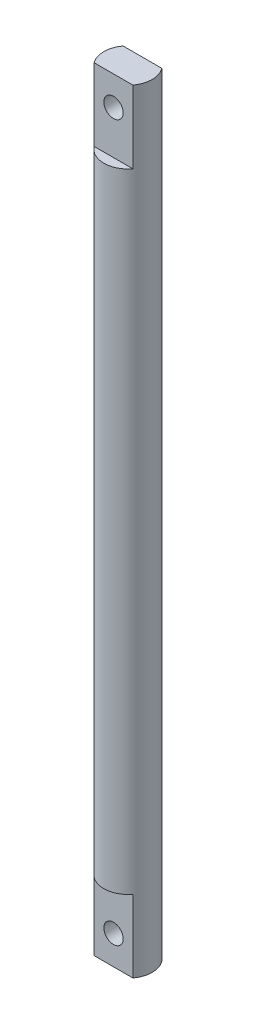
ISO-10303-21;
HEADER;
FILE_DESCRIPTION(('STEP AP214'),'2;1');
FILE_NAME('part.step','',(''),(''),'','','');
FILE_SCHEMA(('AUTOMOTIVE_DESIGN { 1 0 10303 214 1 1 1 1 }'));
ENDSEC;
DATA;
#1=APPLICATION_CONTEXT('core data for automotive mechanical design processes');
#2=APPLICATION_PROTOCOL_DEFINITION('international standard','automotive_design',2000,#1);
#3=PRODUCT_CONTEXT('',#1,'mechanical');
#4=PRODUCT('Part','Part','',(#3));
#5=PRODUCT_RELATED_PRODUCT_CATEGORY('part','',(#4));
#6=PRODUCT_DEFINITION_FORMATION('','',#4);
#7=PRODUCT_DEFINITION_CONTEXT('part definition',#1,'design');
#8=PRODUCT_DEFINITION('design','',#6,#7);
#9=PRODUCT_DEFINITION_SHAPE('','',#8);
#10=(LENGTH_UNIT() NAMED_UNIT(*) SI_UNIT(.MILLI.,.METRE.));
#11=(NAMED_UNIT(*) PLANE_ANGLE_UNIT() SI_UNIT($,.RADIAN.));
#12=(NAMED_UNIT(*) SI_UNIT($,.STERADIAN.) SOLID_ANGLE_UNIT());
#13=UNCERTAINTY_MEASURE_WITH_UNIT(LENGTH_MEASURE(1.E-05),#10,'distance_accuracy_value','');
#14=(GEOMETRIC_REPRESENTATION_CONTEXT(3) GLOBAL_UNCERTAINTY_ASSIGNED_CONTEXT((#13)) GLOBAL_UNIT_ASSIGNED_CONTEXT((#10,
#11,#12)) REPRESENTATION_CONTEXT('',''));
#15=CARTESIAN_POINT('',(0.,0.,0.));
#16=DIRECTION('',(0.,0.,1.));
#17=DIRECTION('',(1.,0.,0.));
#18=AXIS2_PLACEMENT_3D('',#15,#16,#17);
#19=CARTESIAN_POINT('',(0.,80.,0.));
#20=DIRECTION('',(0.,-1.,0.));
#21=DIRECTION('',(0.,0.,-1.));
#22=AXIS2_PLACEMENT_3D('',#19,#20,#21);
#23=CYLINDRICAL_SURFACE('',#22,5.);
#24=CARTESIAN_POINT('',(0.,80.,0.));
#25=DIRECTION('',(0.,1.,0.));
#26=DIRECTION('',(0.,0.,1.));
#27=AXIS2_PLACEMENT_3D('',#24,#25,#26);
#28=CIRCLE('',#27,5.);
#29=CARTESIAN_POINT('',(4.00000000000001,80.,3.));
#30=VERTEX_POINT('',#29);
#31=CARTESIAN_POINT('',(4.00000000000001,80.,-3.));
#32=VERTEX_POINT('',#31);
#33=EDGE_CURVE('E11',#30,#32,#28,.T.);
#34=ORIENTED_EDGE('',*,*,#33,.F.);
#35=DIRECTION('',(0.,1.,0.));
#36=VECTOR('',#35,1.);
#37=CARTESIAN_POINT('',(4.00000000000001,65.,3.));
#38=LINE('',#37,#36);
#39=CARTESIAN_POINT('',(4.00000000000001,65.,3.));
#40=VERTEX_POINT('',#39);
#41=EDGE_CURVE('E153',#40,#30,#38,.T.);
#42=ORIENTED_EDGE('',*,*,#41,.F.);
#43=CARTESIAN_POINT('',(0.,65.,0.));
#44=DIRECTION('',(0.,1.,0.));
#45=DIRECTION('',(0.,0.,1.));
#46=AXIS2_PLACEMENT_3D('',#43,#44,#45);
#47=CIRCLE('',#46,5.);
#48=CARTESIAN_POINT('',(-4.00000000000001,65.,3.));
#49=VERTEX_POINT('',#48);
#50=EDGE_CURVE('E145',#49,#40,#47,.T.);
#51=ORIENTED_EDGE('',*,*,#50,.F.);
#52=DIRECTION('',(0.,1.,0.));
#53=VECTOR('',#52,1.);
#54=CARTESIAN_POINT('',(-4.00000000000001,65.,3.));
#55=LINE('',#54,#53);
#56=CARTESIAN_POINT('',(-4.00000000000001,80.,3.));
#57=VERTEX_POINT('',#56);
#58=EDGE_CURVE('E157',#49,#57,#55,.T.);
#59=ORIENTED_EDGE('',*,*,#58,.T.);
#60=CARTESIAN_POINT('',(-4.00000000000001,80.,-3.));
#61=VERTEX_POINT('',#60);
#62=EDGE_CURVE('E48',#61,#57,#28,.T.);
#63=ORIENTED_EDGE('',*,*,#62,.F.);
#64=DIRECTION('',(0.,1.,0.));
#65=VECTOR('',#64,1.);
#66=CARTESIAN_POINT('',(-4.00000000000001,65.,-3.));
#67=LINE('',#66,#65);
#68=CARTESIAN_POINT('',(-4.00000000000001,65.,-3.));
#69=VERTEX_POINT('',#68);
#70=EDGE_CURVE('E170',#69,#61,#67,.T.);
#71=ORIENTED_EDGE('',*,*,#70,.F.);
#72=CARTESIAN_POINT('',(0.,65.,0.));
#73=DIRECTION('',(0.,1.,0.));
#74=DIRECTION('',(0.,0.,1.));
#75=AXIS2_PLACEMENT_3D('',#72,#73,#74);
#76=CIRCLE('',#75,5.);
#77=CARTESIAN_POINT('',(4.00000000000001,65.,-3.));
#78=VERTEX_POINT('',#77);
#79=EDGE_CURVE('E163',#78,#69,#76,.T.);
#80=ORIENTED_EDGE('',*,*,#79,.F.);
#81=DIRECTION('',(0.,1.,0.));
#82=VECTOR('',#81,1.);
#83=CARTESIAN_POINT('',(4.00000000000001,65.,-3.));
#84=LINE('',#83,#82);
#85=EDGE_CURVE('E156',#78,#32,#84,.T.);
#86=ORIENTED_EDGE('',*,*,#85,.T.);
#87=EDGE_LOOP('',(#34,#42,#51,#59,#63,#71,#80,#86));
#88=FACE_BOUND('',#87,.T.);
#89=DIRECTION('',(0.,-1.,0.));
#90=VECTOR('',#89,1.);
#91=CARTESIAN_POINT('',(-4.00000000000001,-65.,3.));
#92=LINE('',#91,#90);
#93=CARTESIAN_POINT('',(-4.00000000000001,-65.,3.));
#94=VERTEX_POINT('',#93);
#95=CARTESIAN_POINT('',(-4.00000000000001,-80.,3.));
#96=VERTEX_POINT('',#95);
#97=EDGE_CURVE('E55',#94,#96,#92,.T.);
#98=ORIENTED_EDGE('',*,*,#97,.F.);
#99=CARTESIAN_POINT('',(0.,-65.,0.));
#100=DIRECTION('',(0.,1.,0.));
#101=DIRECTION('',(0.,0.,1.));
#102=AXIS2_PLACEMENT_3D('',#99,#100,#101);
#103=CIRCLE('',#102,5.);
#104=CARTESIAN_POINT('',(4.00000000000001,-65.,3.));
#105=VERTEX_POINT('',#104);
#106=EDGE_CURVE('E111',#94,#105,#103,.T.);
#107=ORIENTED_EDGE('',*,*,#106,.T.);
#108=DIRECTION('',(0.,-1.,0.));
#109=VECTOR('',#108,1.);
#110=CARTESIAN_POINT('',(4.00000000000001,-65.,3.));
#111=LINE('',#110,#109);
#112=CARTESIAN_POINT('',(4.00000000000001,-80.,3.));
#113=VERTEX_POINT('',#112);
#114=EDGE_CURVE('E107',#105,#113,#111,.T.);
#115=ORIENTED_EDGE('',*,*,#114,.T.);
#116=CARTESIAN_POINT('',(0.,-80.,0.));
#117=DIRECTION('',(0.,1.,0.));
#118=DIRECTION('',(0.,0.,1.));
#119=AXIS2_PLACEMENT_3D('',#116,#117,#118);
#120=CIRCLE('',#119,5.);
#121=CARTESIAN_POINT('',(4.00000000000001,-80.,-3.));
#122=VERTEX_POINT('',#121);
#123=EDGE_CURVE('E42',#113,#122,#120,.T.);
#124=ORIENTED_EDGE('',*,*,#123,.T.);
#125=DIRECTION('',(0.,-1.,0.));
#126=VECTOR('',#125,1.);
#127=CARTESIAN_POINT('',(4.00000000000001,-65.,-3.));
#128=LINE('',#127,#126);
#129=CARTESIAN_POINT('',(4.00000000000001,-65.,-3.));
#130=VERTEX_POINT('',#129);
#131=EDGE_CURVE('E63',#130,#122,#128,.T.);
#132=ORIENTED_EDGE('',*,*,#131,.F.);
#133=CARTESIAN_POINT('',(0.,-65.,0.));
#134=DIRECTION('',(0.,1.,0.));
#135=DIRECTION('',(0.,0.,1.));
#136=AXIS2_PLACEMENT_3D('',#133,#134,#135);
#137=CIRCLE('',#136,5.);
#138=CARTESIAN_POINT('',(-4.00000000000001,-65.,-3.));
#139=VERTEX_POINT('',#138);
#140=EDGE_CURVE('E129',#130,#139,#137,.T.);
#141=ORIENTED_EDGE('',*,*,#140,.T.);
#142=DIRECTION('',(0.,-1.,0.));
#143=VECTOR('',#142,1.);
#144=CARTESIAN_POINT('',(-4.00000000000001,-65.,-3.));
#145=LINE('',#144,#143);
#146=CARTESIAN_POINT('',(-4.00000000000001,-80.,-3.));
#147=VERTEX_POINT('',#146);
#148=EDGE_CURVE('E140',#139,#147,#145,.T.);
#149=ORIENTED_EDGE('',*,*,#148,.T.);
#150=EDGE_CURVE('E121',#147,#96,#120,.T.);
#151=ORIENTED_EDGE('',*,*,#150,.T.);
#152=EDGE_LOOP('',(#98,#107,#115,#124,#132,#141,#149,#151));
#153=FACE_BOUND('',#152,.T.);
#154=ADVANCED_FACE('F39',(#88,#153),#23,.T.);
#155=CARTESIAN_POINT('',(0.,-80.,0.));
#156=DIRECTION('',(0.,1.,0.));
#157=DIRECTION('',(0.,0.,1.));
#158=AXIS2_PLACEMENT_3D('',#155,#156,#157);
#159=PLANE('',#158);
#160=DIRECTION('',(-1.,0.,0.));
#161=VECTOR('',#160,1.);
#162=CARTESIAN_POINT('',(-4.00000000000001,-80.,3.));
#163=LINE('',#162,#161);
#164=EDGE_CURVE('E116',#113,#96,#163,.T.);
#165=ORIENTED_EDGE('',*,*,#164,.T.);
#166=ORIENTED_EDGE('',*,*,#150,.F.);
#167=DIRECTION('',(1.,0.,0.));
#168=VECTOR('',#167,1.);
#169=CARTESIAN_POINT('',(-4.00000000000001,-80.,-3.));
#170=LINE('',#169,#168);
#171=EDGE_CURVE('E134',#147,#122,#170,.T.);
#172=ORIENTED_EDGE('',*,*,#171,.T.);
#173=ORIENTED_EDGE('',*,*,#123,.F.);
#174=EDGE_LOOP('',(#165,#166,#172,#173));
#175=FACE_BOUND('',#174,.T.);
#176=ADVANCED_FACE('F197',(#175),#159,.F.);
#177=CARTESIAN_POINT('',(0.,80.,0.));
#178=DIRECTION('',(0.,1.,0.));
#179=DIRECTION('',(0.,0.,1.));
#180=AXIS2_PLACEMENT_3D('',#177,#178,#179);
#181=PLANE('',#180);
#182=DIRECTION('',(-1.,0.,0.));
#183=VECTOR('',#182,1.);
#184=CARTESIAN_POINT('',(-4.00000000000001,80.,3.));
#185=LINE('',#184,#183);
#186=EDGE_CURVE('E149',#30,#57,#185,.T.);
#187=ORIENTED_EDGE('',*,*,#186,.F.);
#188=ORIENTED_EDGE('',*,*,#33,.T.);
#189=DIRECTION('',(1.,0.,0.));
#190=VECTOR('',#189,1.);
#191=CARTESIAN_POINT('',(-4.00000000000001,80.,-3.));
#192=LINE('',#191,#190);
#193=EDGE_CURVE('E125',#61,#32,#192,.T.);
#194=ORIENTED_EDGE('',*,*,#193,.F.);
#195=ORIENTED_EDGE('',*,*,#62,.T.);
#196=EDGE_LOOP('',(#187,#188,#194,#195));
#197=FACE_BOUND('',#196,.T.);
#198=ADVANCED_FACE('F188',(#197),#181,.T.);
#199=CARTESIAN_POINT('',(-4.00000000000001,65.,-3.));
#200=DIRECTION('',(0.,0.,1.));
#201=DIRECTION('',(1.,0.,0.));
#202=AXIS2_PLACEMENT_3D('',#199,#200,#201);
#203=PLANE('',#202);
#204=CARTESIAN_POINT('',(0.,74.,-3.));
#205=DIRECTION('',(0.,0.,1.));
#206=DIRECTION('',(1.,0.,0.));
#207=AXIS2_PLACEMENT_3D('',#204,#205,#206);
#208=CIRCLE('',#207,2.);
#209=CARTESIAN_POINT('',(2.,74.,-3.));
#210=VERTEX_POINT('',#209);
#211=EDGE_CURVE('E139',#210,#210,#208,.T.);
#212=ORIENTED_EDGE('',*,*,#211,.T.);
#213=EDGE_LOOP('',(#212));
#214=FACE_BOUND('',#213,.T.);
#215=ORIENTED_EDGE('',*,*,#193,.T.);
#216=ORIENTED_EDGE('',*,*,#85,.F.);
#217=DIRECTION('',(1.,0.,0.));
#218=VECTOR('',#217,1.);
#219=CARTESIAN_POINT('',(-4.00000000000001,65.,-3.));
#220=LINE('',#219,#218);
#221=EDGE_CURVE('E166',#69,#78,#220,.T.);
#222=ORIENTED_EDGE('',*,*,#221,.F.);
#223=ORIENTED_EDGE('',*,*,#70,.T.);
#224=EDGE_LOOP('',(#215,#216,#222,#223));
#225=FACE_BOUND('',#224,.T.);
#226=ADVANCED_FACE('F181',(#214,#225),#203,.F.);
#227=CARTESIAN_POINT('',(0.,65.,0.));
#228=DIRECTION('',(0.,1.,0.));
#229=DIRECTION('',(0.,0.,1.));
#230=AXIS2_PLACEMENT_3D('',#227,#228,#229);
#231=PLANE('',#230);
#232=ORIENTED_EDGE('',*,*,#79,.T.);
#233=ORIENTED_EDGE('',*,*,#221,.T.);
#234=EDGE_LOOP('',(#232,#233));
#235=FACE_BOUND('',#234,.T.);
#236=ADVANCED_FACE('F225',(#235),#231,.T.);
#237=CARTESIAN_POINT('',(-4.00000000000001,65.,3.));
#238=DIRECTION('',(0.,0.,-1.));
#239=DIRECTION('',(-1.,0.,0.));
#240=AXIS2_PLACEMENT_3D('',#237,#238,#239);
#241=PLANE('',#240);
#242=CARTESIAN_POINT('',(0.,74.,3.));
#243=DIRECTION('',(0.,0.,1.));
#244=DIRECTION('',(1.,0.,0.));
#245=AXIS2_PLACEMENT_3D('',#242,#243,#244);
#246=CIRCLE('',#245,2.);
#247=CARTESIAN_POINT('',(2.,74.,3.));
#248=VERTEX_POINT('',#247);
#249=EDGE_CURVE('E324',#248,#248,#246,.T.);
#250=ORIENTED_EDGE('',*,*,#249,.F.);
#251=EDGE_LOOP('',(#250));
#252=FACE_BOUND('',#251,.T.);
#253=ORIENTED_EDGE('',*,*,#186,.T.);
#254=ORIENTED_EDGE('',*,*,#58,.F.);
#255=DIRECTION('',(-1.,0.,0.));
#256=VECTOR('',#255,1.);
#257=CARTESIAN_POINT('',(-4.00000000000001,65.,3.));
#258=LINE('',#257,#256);
#259=EDGE_CURVE('E148',#40,#49,#258,.T.);
#260=ORIENTED_EDGE('',*,*,#259,.F.);
#261=ORIENTED_EDGE('',*,*,#41,.T.);
#262=EDGE_LOOP('',(#253,#254,#260,#261));
#263=FACE_BOUND('',#262,.T.);
#264=ADVANCED_FACE('F229',(#252,#263),#241,.F.);
#265=CARTESIAN_POINT('',(0.,65.,0.));
#266=DIRECTION('',(0.,1.,0.));
#267=DIRECTION('',(0.,0.,1.));
#268=AXIS2_PLACEMENT_3D('',#265,#266,#267);
#269=PLANE('',#268);
#270=ORIENTED_EDGE('',*,*,#50,.T.);
#271=ORIENTED_EDGE('',*,*,#259,.T.);
#272=EDGE_LOOP('',(#270,#271));
#273=FACE_BOUND('',#272,.T.);
#274=ADVANCED_FACE('F211',(#273),#269,.T.);
#275=CARTESIAN_POINT('',(-4.00000000000001,-65.,-3.));
#276=DIRECTION('',(0.,0.,-1.));
#277=DIRECTION('',(-1.,0.,0.));
#278=AXIS2_PLACEMENT_3D('',#275,#276,#277);
#279=PLANE('',#278);
#280=CARTESIAN_POINT('',(0.,-74.,-3.));
#281=DIRECTION('',(0.,0.,-1.));
#282=DIRECTION('',(-1.,0.,0.));
#283=AXIS2_PLACEMENT_3D('',#280,#281,#282);
#284=CIRCLE('',#283,2.);
#285=CARTESIAN_POINT('',(-2.,-74.,-3.));
#286=VERTEX_POINT('',#285);
#287=EDGE_CURVE('E330',#286,#286,#284,.F.);
#288=ORIENTED_EDGE('',*,*,#287,.T.);
#289=EDGE_LOOP('',(#288));
#290=FACE_BOUND('',#289,.T.);
#291=ORIENTED_EDGE('',*,*,#171,.F.);
#292=ORIENTED_EDGE('',*,*,#148,.F.);
#293=DIRECTION('',(1.,0.,0.));
#294=VECTOR('',#293,1.);
#295=CARTESIAN_POINT('',(-4.00000000000001,-65.,-3.));
#296=LINE('',#295,#294);
#297=EDGE_CURVE('E133',#139,#130,#296,.T.);
#298=ORIENTED_EDGE('',*,*,#297,.T.);
#299=ORIENTED_EDGE('',*,*,#131,.T.);
#300=EDGE_LOOP('',(#291,#292,#298,#299));
#301=FACE_BOUND('',#300,.T.);
#302=ADVANCED_FACE('F199',(#290,#301),#279,.T.);
#303=CARTESIAN_POINT('',(0.,-65.,0.));
#304=DIRECTION('',(0.,-1.,0.));
#305=DIRECTION('',(0.,0.,1.));
#306=AXIS2_PLACEMENT_3D('',#303,#304,#305);
#307=PLANE('',#306);
#308=ORIENTED_EDGE('',*,*,#140,.F.);
#309=ORIENTED_EDGE('',*,*,#297,.F.);
#310=EDGE_LOOP('',(#308,#309));
#311=FACE_BOUND('',#310,.T.);
#312=ADVANCED_FACE('F202',(#311),#307,.T.);
#313=CARTESIAN_POINT('',(-4.00000000000001,-65.,3.));
#314=DIRECTION('',(0.,0.,1.));
#315=DIRECTION('',(1.,0.,0.));
#316=AXIS2_PLACEMENT_3D('',#313,#314,#315);
#317=PLANE('',#316);
#318=CARTESIAN_POINT('',(0.,-74.,3.));
#319=DIRECTION('',(0.,0.,-1.));
#320=DIRECTION('',(1.,0.,0.));
#321=AXIS2_PLACEMENT_3D('',#318,#319,#320);
#322=CIRCLE('',#321,2.);
#323=CARTESIAN_POINT('',(2.,-74.,3.));
#324=VERTEX_POINT('',#323);
#325=EDGE_CURVE('E337',#324,#324,#322,.T.);
#326=ORIENTED_EDGE('',*,*,#325,.T.);
#327=EDGE_LOOP('',(#326));
#328=FACE_BOUND('',#327,.T.);
#329=ORIENTED_EDGE('',*,*,#164,.F.);
#330=ORIENTED_EDGE('',*,*,#114,.F.);
#331=DIRECTION('',(-1.,0.,0.));
#332=VECTOR('',#331,1.);
#333=CARTESIAN_POINT('',(-4.00000000000001,-65.,3.));
#334=LINE('',#333,#332);
#335=EDGE_CURVE('E103',#105,#94,#334,.T.);
#336=ORIENTED_EDGE('',*,*,#335,.T.);
#337=ORIENTED_EDGE('',*,*,#97,.T.);
#338=EDGE_LOOP('',(#329,#330,#336,#337));
#339=FACE_BOUND('',#338,.T.);
#340=ADVANCED_FACE('F105',(#328,#339),#317,.T.);
#341=CARTESIAN_POINT('',(0.,-65.,0.));
#342=DIRECTION('',(0.,-1.,0.));
#343=DIRECTION('',(0.,0.,1.));
#344=AXIS2_PLACEMENT_3D('',#341,#342,#343);
#345=PLANE('',#344);
#346=ORIENTED_EDGE('',*,*,#106,.F.);
#347=ORIENTED_EDGE('',*,*,#335,.F.);
#348=EDGE_LOOP('',(#346,#347));
#349=FACE_BOUND('',#348,.T.);
#350=ADVANCED_FACE('F113',(#349),#345,.T.);
#351=CARTESIAN_POINT('',(0.,74.,-5.));
#352=DIRECTION('',(0.,0.,1.));
#353=DIRECTION('',(1.,0.,0.));
#354=AXIS2_PLACEMENT_3D('',#351,#352,#353);
#355=CYLINDRICAL_SURFACE('',#354,2.);
#356=ORIENTED_EDGE('',*,*,#249,.T.);
#357=EDGE_LOOP('',(#356));
#358=FACE_BOUND('',#357,.T.);
#359=ORIENTED_EDGE('',*,*,#211,.F.);
#360=EDGE_LOOP('',(#359));
#361=FACE_BOUND('',#360,.T.);
#362=ADVANCED_FACE('F256',(#358,#361),#355,.F.);
#363=CARTESIAN_POINT('',(0.,-74.,-5.));
#364=DIRECTION('',(0.,0.,1.));
#365=DIRECTION('',(1.,0.,0.));
#366=AXIS2_PLACEMENT_3D('',#363,#364,#365);
#367=CYLINDRICAL_SURFACE('',#366,2.);
#368=ORIENTED_EDGE('',*,*,#287,.F.);
#369=EDGE_LOOP('',(#368));
#370=FACE_BOUND('',#369,.T.);
#371=ORIENTED_EDGE('',*,*,#325,.F.);
#372=EDGE_LOOP('',(#371));
#373=FACE_BOUND('',#372,.T.);
#374=ADVANCED_FACE('F268',(#370,#373),#367,.F.);
#375=CLOSED_SHELL('',(#154,#176,#198,#226,#236,#264,#274,#302,#312,#340,#350,#362,#374));
#376=MANIFOLD_SOLID_BREP('B2',#375);
#377=ADVANCED_BREP_SHAPE_REPRESENTATION('',(#18,#376),#14);
#378=SHAPE_DEFINITION_REPRESENTATION(#9,#377);
ENDSEC;
END-ISO-10303-21;
